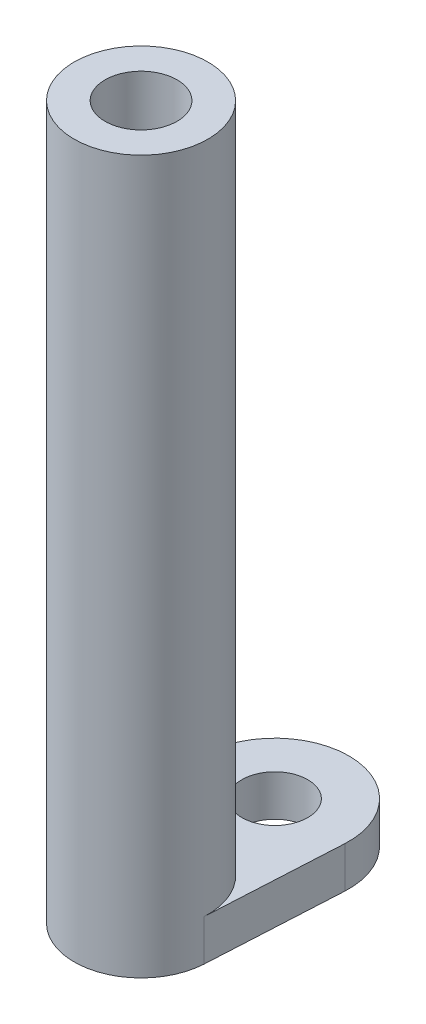
ISO-10303-21;
HEADER;
FILE_DESCRIPTION(('STEP AP214'),'2;1');
FILE_NAME('part.step','',(''),(''),'','','');
FILE_SCHEMA(('AUTOMOTIVE_DESIGN { 1 0 10303 214 1 1 1 1 }'));
ENDSEC;
DATA;
#1=APPLICATION_CONTEXT('core data for automotive mechanical design processes');
#2=APPLICATION_PROTOCOL_DEFINITION('international standard','automotive_design',2000,#1);
#3=PRODUCT_CONTEXT('',#1,'mechanical');
#4=PRODUCT('Part','Part','',(#3));
#5=PRODUCT_RELATED_PRODUCT_CATEGORY('part','',(#4));
#6=PRODUCT_DEFINITION_FORMATION('','',#4);
#7=PRODUCT_DEFINITION_CONTEXT('part definition',#1,'design');
#8=PRODUCT_DEFINITION('design','',#6,#7);
#9=PRODUCT_DEFINITION_SHAPE('','',#8);
#10=(LENGTH_UNIT() NAMED_UNIT(*) SI_UNIT(.MILLI.,.METRE.));
#11=(NAMED_UNIT(*) PLANE_ANGLE_UNIT() SI_UNIT($,.RADIAN.));
#12=(NAMED_UNIT(*) SI_UNIT($,.STERADIAN.) SOLID_ANGLE_UNIT());
#13=UNCERTAINTY_MEASURE_WITH_UNIT(LENGTH_MEASURE(1.E-05),#10,'distance_accuracy_value','');
#14=(GEOMETRIC_REPRESENTATION_CONTEXT(3) GLOBAL_UNCERTAINTY_ASSIGNED_CONTEXT((#13)) GLOBAL_UNIT_ASSIGNED_CONTEXT((#10,
#11,#12)) REPRESENTATION_CONTEXT('',''));
#15=CARTESIAN_POINT('',(0.,0.,0.));
#16=DIRECTION('',(0.,0.,1.));
#17=DIRECTION('',(1.,0.,0.));
#18=AXIS2_PLACEMENT_3D('',#15,#16,#17);
#19=CARTESIAN_POINT('',(0.,43.817388155428,0.));
#20=DIRECTION('',(0.,-1.,0.));
#21=DIRECTION('',(0.,0.,1.));
#22=AXIS2_PLACEMENT_3D('',#19,#20,#21);
#23=CYLINDRICAL_SURFACE('',#22,3.25);
#24=CARTESIAN_POINT('',(0.,2.,0.));
#25=DIRECTION('',(0.,-1.,0.));
#26=DIRECTION('',(0.,0.,-1.));
#27=AXIS2_PLACEMENT_3D('',#24,#25,#26);
#28=CIRCLE('',#27,3.25);
#29=CARTESIAN_POINT('',(-3.24528504141008,2.,0.175));
#30=VERTEX_POINT('',#29);
#31=CARTESIAN_POINT('',(3.24528504141008,2.,0.175));
#32=VERTEX_POINT('',#31);
#33=EDGE_CURVE('E91',#30,#32,#28,.T.);
#34=ORIENTED_EDGE('',*,*,#33,.F.);
#35=DIRECTION('',(0.,-1.,0.));
#36=VECTOR('',#35,1.);
#37=CARTESIAN_POINT('',(-3.24528504141008,2.,0.175));
#38=LINE('',#37,#36);
#39=CARTESIAN_POINT('',(-3.24528504141008,0.,0.175));
#40=VERTEX_POINT('',#39);
#41=EDGE_CURVE('E112',#30,#40,#38,.T.);
#42=ORIENTED_EDGE('',*,*,#41,.T.);
#43=CARTESIAN_POINT('',(0.,0.,0.));
#44=DIRECTION('',(0.,-1.,0.));
#45=DIRECTION('',(0.,0.,-1.));
#46=AXIS2_PLACEMENT_3D('',#43,#44,#45);
#47=CIRCLE('',#46,3.25);
#48=CARTESIAN_POINT('',(3.24528504141008,0.,0.175));
#49=VERTEX_POINT('',#48);
#50=EDGE_CURVE('E49',#49,#40,#47,.T.);
#51=ORIENTED_EDGE('',*,*,#50,.F.);
#52=DIRECTION('',(0.,-1.,0.));
#53=VECTOR('',#52,1.);
#54=CARTESIAN_POINT('',(3.24528504141008,2.,0.175));
#55=LINE('',#54,#53);
#56=EDGE_CURVE('E92',#32,#49,#55,.T.);
#57=ORIENTED_EDGE('',*,*,#56,.F.);
#58=EDGE_LOOP('',(#34,#42,#51,#57));
#59=FACE_BOUND('',#58,.T.);
#60=CARTESIAN_POINT('',(0.,34.6250000000029,0.));
#61=DIRECTION('',(0.,-1.,0.));
#62=DIRECTION('',(-1.,0.,0.));
#63=AXIS2_PLACEMENT_3D('',#60,#61,#62);
#64=CIRCLE('',#63,3.25);
#65=CARTESIAN_POINT('',(-3.25,34.6250000000029,0.));
#66=VERTEX_POINT('',#65);
#67=EDGE_CURVE('E11',#66,#66,#64,.T.);
#68=ORIENTED_EDGE('',*,*,#67,.T.);
#69=EDGE_LOOP('',(#68));
#70=FACE_BOUND('',#69,.T.);
#71=ADVANCED_FACE('F41',(#59,#70),#23,.T.);
#72=CARTESIAN_POINT('',(0.,0.,0.));
#73=DIRECTION('',(0.,1.,0.));
#74=DIRECTION('',(0.,0.,-1.));
#75=AXIS2_PLACEMENT_3D('',#72,#73,#74);
#76=PLANE('',#75);
#77=ORIENTED_EDGE('',*,*,#50,.T.);
#78=DIRECTION('',(-0.0538461538461538,0.,-0.998549243510793));
#79=VECTOR('',#78,1.);
#80=CARTESIAN_POINT('',(-3.59477727663885,0.,-6.30615384615385));
#81=LINE('',#80,#79);
#82=CARTESIAN_POINT('',(-3.59477727663885,0.,-6.30615384615385));
#83=VERTEX_POINT('',#82);
#84=EDGE_CURVE('E97',#40,#83,#81,.T.);
#85=ORIENTED_EDGE('',*,*,#84,.T.);
#86=CARTESIAN_POINT('',(0.,0.,-6.5));
#87=DIRECTION('',(0.,-1.,0.));
#88=DIRECTION('',(0.,0.,-1.));
#89=AXIS2_PLACEMENT_3D('',#86,#87,#88);
#90=CIRCLE('',#89,3.6);
#91=CARTESIAN_POINT('',(3.59477727663885,0.,-6.30615384615385));
#92=VERTEX_POINT('',#91);
#93=EDGE_CURVE('E105',#83,#92,#90,.T.);
#94=ORIENTED_EDGE('',*,*,#93,.T.);
#95=DIRECTION('',(-0.0538461538461538,0.,0.998549243510793));
#96=VECTOR('',#95,1.);
#97=CARTESIAN_POINT('',(3.59477727663885,0.,-6.30615384615385));
#98=LINE('',#97,#96);
#99=EDGE_CURVE('E87',#92,#49,#98,.T.);
#100=ORIENTED_EDGE('',*,*,#99,.T.);
#101=EDGE_LOOP('',(#77,#85,#94,#100));
#102=FACE_BOUND('',#101,.T.);
#103=CARTESIAN_POINT('',(0.,0.,0.));
#104=DIRECTION('',(0.,-1.,0.));
#105=DIRECTION('',(0.,0.,-1.));
#106=AXIS2_PLACEMENT_3D('',#103,#104,#105);
#107=CIRCLE('',#106,1.75);
#108=CARTESIAN_POINT('',(0.,0.,-1.75));
#109=VERTEX_POINT('',#108);
#110=EDGE_CURVE('E117',#109,#109,#107,.T.);
#111=ORIENTED_EDGE('',*,*,#110,.F.);
#112=EDGE_LOOP('',(#111));
#113=FACE_BOUND('',#112,.T.);
#114=CARTESIAN_POINT('',(0.,0.,-6.5));
#115=DIRECTION('',(0.,-1.,0.));
#116=DIRECTION('',(0.,0.,-1.));
#117=AXIS2_PLACEMENT_3D('',#114,#115,#116);
#118=CIRCLE('',#117,1.6);
#119=CARTESIAN_POINT('',(0.,0.,-8.1));
#120=VERTEX_POINT('',#119);
#121=EDGE_CURVE('E163',#120,#120,#118,.T.);
#122=ORIENTED_EDGE('',*,*,#121,.F.);
#123=EDGE_LOOP('',(#122));
#124=FACE_BOUND('',#123,.T.);
#125=ADVANCED_FACE('F122',(#102,#113,#124),#76,.F.);
#126=CARTESIAN_POINT('',(0.,43.817388155428,0.));
#127=DIRECTION('',(0.,-1.,0.));
#128=DIRECTION('',(0.,0.,1.));
#129=AXIS2_PLACEMENT_3D('',#126,#127,#128);
#130=CYLINDRICAL_SURFACE('',#129,1.75);
#131=CARTESIAN_POINT('',(0.,34.6250000000029,0.));
#132=DIRECTION('',(0.,-1.,0.));
#133=DIRECTION('',(-1.,0.,0.));
#134=AXIS2_PLACEMENT_3D('',#131,#132,#133);
#135=CIRCLE('',#134,1.75);
#136=CARTESIAN_POINT('',(-1.75,34.6250000000029,0.));
#137=VERTEX_POINT('',#136);
#138=EDGE_CURVE('E44',#137,#137,#135,.T.);
#139=ORIENTED_EDGE('',*,*,#138,.F.);
#140=EDGE_LOOP('',(#139));
#141=FACE_BOUND('',#140,.T.);
#142=ORIENTED_EDGE('',*,*,#110,.T.);
#143=EDGE_LOOP('',(#142));
#144=FACE_BOUND('',#143,.T.);
#145=ADVANCED_FACE('F143',(#141,#144),#130,.F.);
#146=CARTESIAN_POINT('',(0.,34.6250000000029,-37.5));
#147=DIRECTION('',(0.,1.,0.));
#148=DIRECTION('',(0.707106781186549,0.,0.707106781186546));
#149=AXIS2_PLACEMENT_3D('',#146,#147,#148);
#150=PLANE('',#149);
#151=ORIENTED_EDGE('',*,*,#138,.T.);
#152=EDGE_LOOP('',(#151));
#153=FACE_BOUND('',#152,.T.);
#154=ORIENTED_EDGE('',*,*,#67,.F.);
#155=EDGE_LOOP('',(#154));
#156=FACE_BOUND('',#155,.T.);
#157=ADVANCED_FACE('F147',(#153,#156),#150,.T.);
#158=CARTESIAN_POINT('',(0.,2.,-6.5));
#159=DIRECTION('',(0.,1.,0.));
#160=DIRECTION('',(0.,0.,-1.));
#161=AXIS2_PLACEMENT_3D('',#158,#159,#160);
#162=PLANE('',#161);
#163=CARTESIAN_POINT('',(0.,2.,-6.5));
#164=DIRECTION('',(0.,-1.,0.));
#165=DIRECTION('',(0.,0.,-1.));
#166=AXIS2_PLACEMENT_3D('',#163,#164,#165);
#167=CIRCLE('',#166,1.6);
#168=CARTESIAN_POINT('',(0.,2.,-8.1));
#169=VERTEX_POINT('',#168);
#170=EDGE_CURVE('E107',#169,#169,#167,.T.);
#171=ORIENTED_EDGE('',*,*,#170,.T.);
#172=EDGE_LOOP('',(#171));
#173=FACE_BOUND('',#172,.T.);
#174=ORIENTED_EDGE('',*,*,#33,.T.);
#175=DIRECTION('',(-0.0538461538461538,0.,0.998549243510793));
#176=VECTOR('',#175,1.);
#177=CARTESIAN_POINT('',(3.59477727663885,2.,-6.30615384615385));
#178=LINE('',#177,#176);
#179=CARTESIAN_POINT('',(3.59477727663885,2.,-6.30615384615385));
#180=VERTEX_POINT('',#179);
#181=EDGE_CURVE('E57',#180,#32,#178,.T.);
#182=ORIENTED_EDGE('',*,*,#181,.F.);
#183=CARTESIAN_POINT('',(0.,2.,-6.5));
#184=DIRECTION('',(0.,-1.,0.));
#185=DIRECTION('',(0.,0.,-1.));
#186=AXIS2_PLACEMENT_3D('',#183,#184,#185);
#187=CIRCLE('',#186,3.6);
#188=CARTESIAN_POINT('',(-3.59477727663885,2.,-6.30615384615385));
#189=VERTEX_POINT('',#188);
#190=EDGE_CURVE('E94',#189,#180,#187,.T.);
#191=ORIENTED_EDGE('',*,*,#190,.F.);
#192=DIRECTION('',(-0.0538461538461538,0.,-0.998549243510793));
#193=VECTOR('',#192,1.);
#194=CARTESIAN_POINT('',(-3.59477727663885,2.,-6.30615384615385));
#195=LINE('',#194,#193);
#196=EDGE_CURVE('E65',#30,#189,#195,.T.);
#197=ORIENTED_EDGE('',*,*,#196,.F.);
#198=EDGE_LOOP('',(#174,#182,#191,#197));
#199=FACE_BOUND('',#198,.T.);
#200=ADVANCED_FACE('F99',(#173,#199),#162,.T.);
#201=CARTESIAN_POINT('',(0.,2.,-6.5));
#202=DIRECTION('',(0.,-1.,0.));
#203=DIRECTION('',(0.,0.,1.));
#204=AXIS2_PLACEMENT_3D('',#201,#202,#203);
#205=CYLINDRICAL_SURFACE('',#204,3.6);
#206=ORIENTED_EDGE('',*,*,#93,.F.);
#207=DIRECTION('',(0.,-1.,0.));
#208=VECTOR('',#207,1.);
#209=CARTESIAN_POINT('',(-3.59477727663885,2.,-6.30615384615385));
#210=LINE('',#209,#208);
#211=EDGE_CURVE('E96',#189,#83,#210,.T.);
#212=ORIENTED_EDGE('',*,*,#211,.F.);
#213=ORIENTED_EDGE('',*,*,#190,.T.);
#214=DIRECTION('',(0.,-1.,0.));
#215=VECTOR('',#214,1.);
#216=CARTESIAN_POINT('',(3.59477727663885,2.,-6.30615384615385));
#217=LINE('',#216,#215);
#218=EDGE_CURVE('E84',#180,#92,#217,.T.);
#219=ORIENTED_EDGE('',*,*,#218,.T.);
#220=EDGE_LOOP('',(#206,#212,#213,#219));
#221=FACE_BOUND('',#220,.T.);
#222=ADVANCED_FACE('F95',(#221),#205,.T.);
#223=CARTESIAN_POINT('',(3.59477727663885,2.,-6.30615384615385));
#224=DIRECTION('',(-0.998549243510793,0.,-0.0538461538461538));
#225=DIRECTION('',(0.0538461538461538,0.,-0.998549243510793));
#226=AXIS2_PLACEMENT_3D('',#223,#224,#225);
#227=PLANE('',#226);
#228=ORIENTED_EDGE('',*,*,#99,.F.);
#229=ORIENTED_EDGE('',*,*,#218,.F.);
#230=ORIENTED_EDGE('',*,*,#181,.T.);
#231=ORIENTED_EDGE('',*,*,#56,.T.);
#232=EDGE_LOOP('',(#228,#229,#230,#231));
#233=FACE_BOUND('',#232,.T.);
#234=ADVANCED_FACE('F86',(#233),#227,.F.);
#235=CARTESIAN_POINT('',(-3.59477727663885,2.,-6.30615384615385));
#236=DIRECTION('',(0.998549243510793,0.,-0.0538461538461538));
#237=DIRECTION('',(0.0538461538461538,0.,0.998549243510793));
#238=AXIS2_PLACEMENT_3D('',#235,#236,#237);
#239=PLANE('',#238);
#240=ORIENTED_EDGE('',*,*,#84,.F.);
#241=ORIENTED_EDGE('',*,*,#41,.F.);
#242=ORIENTED_EDGE('',*,*,#196,.T.);
#243=ORIENTED_EDGE('',*,*,#211,.T.);
#244=EDGE_LOOP('',(#240,#241,#242,#243));
#245=FACE_BOUND('',#244,.T.);
#246=ADVANCED_FACE('F127',(#245),#239,.F.);
#247=CARTESIAN_POINT('',(0.,2.,-6.5));
#248=DIRECTION('',(0.,-1.,0.));
#249=DIRECTION('',(0.,0.,1.));
#250=AXIS2_PLACEMENT_3D('',#247,#248,#249);
#251=CYLINDRICAL_SURFACE('',#250,1.6);
#252=ORIENTED_EDGE('',*,*,#170,.F.);
#253=EDGE_LOOP('',(#252));
#254=FACE_BOUND('',#253,.T.);
#255=ORIENTED_EDGE('',*,*,#121,.T.);
#256=EDGE_LOOP('',(#255));
#257=FACE_BOUND('',#256,.T.);
#258=ADVANCED_FACE('F129',(#254,#257),#251,.F.);
#259=CLOSED_SHELL('',(#71,#125,#145,#157,#200,#222,#234,#246,#258));
#260=MANIFOLD_SOLID_BREP('B2',#259);
#261=ADVANCED_BREP_SHAPE_REPRESENTATION('',(#18,#260),#14);
#262=SHAPE_DEFINITION_REPRESENTATION(#9,#261);
ENDSEC;
END-ISO-10303-21;
